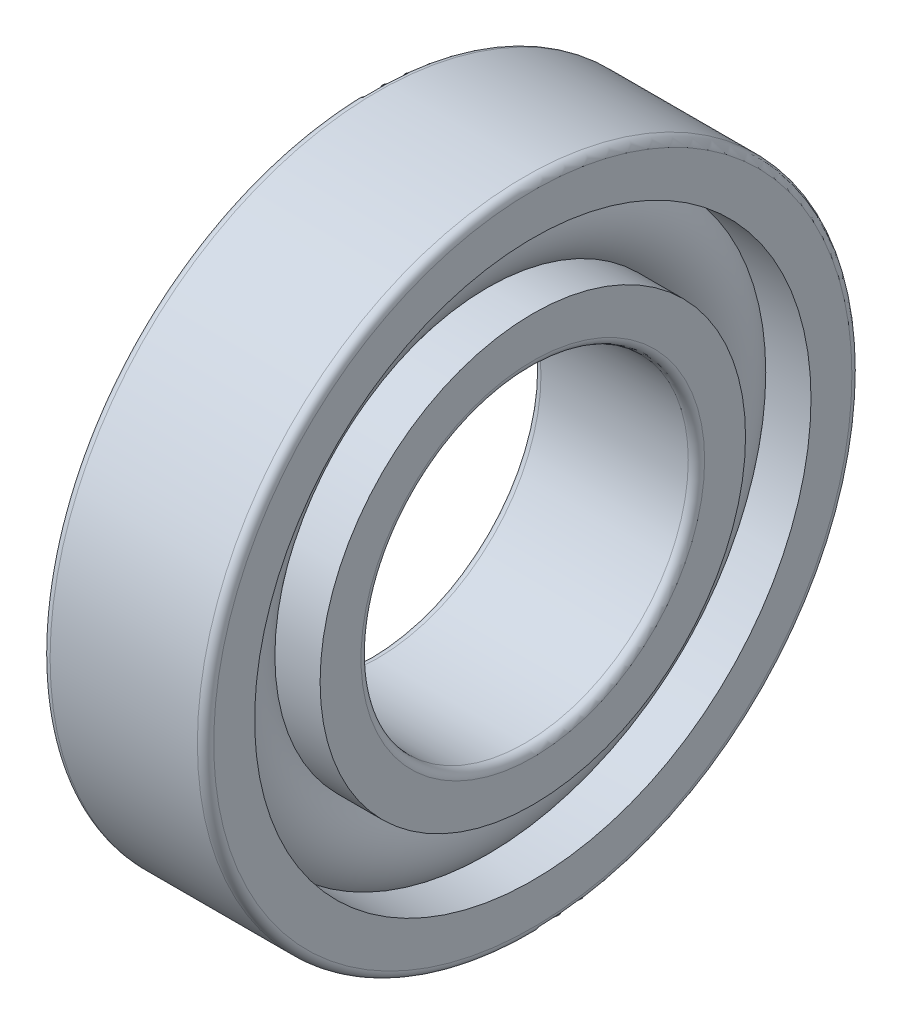
ISO-10303-21;
HEADER;
FILE_DESCRIPTION(('STEP AP214'),'2;1');
FILE_NAME('part.step','',(''),(''),'','','');
FILE_SCHEMA(('AUTOMOTIVE_DESIGN { 1 0 10303 214 1 1 1 1 }'));
ENDSEC;
DATA;
#1=APPLICATION_CONTEXT('core data for automotive mechanical design processes');
#2=APPLICATION_PROTOCOL_DEFINITION('international standard','automotive_design',2000,#1);
#3=PRODUCT_CONTEXT('',#1,'mechanical');
#4=PRODUCT('Part','Part','',(#3));
#5=PRODUCT_RELATED_PRODUCT_CATEGORY('part','',(#4));
#6=PRODUCT_DEFINITION_FORMATION('','',#4);
#7=PRODUCT_DEFINITION_CONTEXT('part definition',#1,'design');
#8=PRODUCT_DEFINITION('design','',#6,#7);
#9=PRODUCT_DEFINITION_SHAPE('','',#8);
#10=(LENGTH_UNIT() NAMED_UNIT(*) SI_UNIT(.MILLI.,.METRE.));
#11=(NAMED_UNIT(*) PLANE_ANGLE_UNIT() SI_UNIT($,.RADIAN.));
#12=(NAMED_UNIT(*) SI_UNIT($,.STERADIAN.) SOLID_ANGLE_UNIT());
#13=UNCERTAINTY_MEASURE_WITH_UNIT(LENGTH_MEASURE(1.E-05),#10,'distance_accuracy_value','');
#14=(GEOMETRIC_REPRESENTATION_CONTEXT(3) GLOBAL_UNCERTAINTY_ASSIGNED_CONTEXT((#13)) GLOBAL_UNIT_ASSIGNED_CONTEXT((#10,
#11,#12)) REPRESENTATION_CONTEXT('',''));
#15=CARTESIAN_POINT('',(0.,0.,0.));
#16=DIRECTION('',(0.,0.,1.));
#17=DIRECTION('',(1.,0.,0.));
#18=AXIS2_PLACEMENT_3D('',#15,#16,#17);
#19=CARTESIAN_POINT('',(0.,0.,0.));
#20=DIRECTION('',(-1.,0.,0.));
#21=DIRECTION('',(0.,0.,1.));
#22=AXIS2_PLACEMENT_3D('',#19,#20,#21);
#23=TOROIDAL_SURFACE('',#22,6.,1.2);
#24=CARTESIAN_POINT('',(0.894427190999912,0.,0.));
#25=DIRECTION('',(-1.,0.,0.));
#26=DIRECTION('',(0.,0.,1.));
#27=AXIS2_PLACEMENT_3D('',#24,#25,#26);
#28=CIRCLE('',#27,6.8);
#29=CARTESIAN_POINT('',(0.894427190999912,0.,6.8));
#30=VERTEX_POINT('',#29);
#31=EDGE_CURVE('E35',#30,#30,#28,.F.);
#32=ORIENTED_EDGE('',*,*,#31,.T.);
#33=EDGE_LOOP('',(#32));
#34=FACE_BOUND('',#33,.T.);
#35=CARTESIAN_POINT('',(0.894427190999914,0.,0.));
#36=DIRECTION('',(-1.,0.,0.));
#37=DIRECTION('',(0.,0.,1.));
#38=AXIS2_PLACEMENT_3D('',#35,#36,#37);
#39=CIRCLE('',#38,5.2);
#40=CARTESIAN_POINT('',(0.894427190999914,0.,5.2));
#41=VERTEX_POINT('',#40);
#42=EDGE_CURVE('E10',#41,#41,#39,.T.);
#43=ORIENTED_EDGE('',*,*,#42,.T.);
#44=EDGE_LOOP('',(#43));
#45=FACE_BOUND('',#44,.T.);
#46=ADVANCED_FACE('F31',(#34,#45),#23,.T.);
#47=CARTESIAN_POINT('',(-20.6375,0.,0.));
#48=DIRECTION('',(1.,0.,0.));
#49=DIRECTION('',(0.,0.,-1.));
#50=AXIS2_PLACEMENT_3D('',#47,#48,#49);
#51=CYLINDRICAL_SURFACE('',#50,5.2);
#52=CARTESIAN_POINT('',(2.,0.,0.));
#53=DIRECTION('',(1.,0.,0.));
#54=DIRECTION('',(0.,0.,-1.));
#55=AXIS2_PLACEMENT_3D('',#52,#53,#54);
#56=CIRCLE('',#55,5.2);
#57=CARTESIAN_POINT('',(2.,0.,-5.2));
#58=VERTEX_POINT('',#57);
#59=EDGE_CURVE('E44',#58,#58,#56,.T.);
#60=ORIENTED_EDGE('',*,*,#59,.F.);
#61=EDGE_LOOP('',(#60));
#62=FACE_BOUND('',#61,.T.);
#63=ORIENTED_EDGE('',*,*,#42,.F.);
#64=EDGE_LOOP('',(#63));
#65=FACE_BOUND('',#64,.T.);
#66=ADVANCED_FACE('F83',(#62,#65),#51,.T.);
#67=CARTESIAN_POINT('',(-20.6375,0.,0.));
#68=DIRECTION('',(1.,0.,0.));
#69=DIRECTION('',(0.,0.,-1.));
#70=AXIS2_PLACEMENT_3D('',#67,#68,#69);
#71=CYLINDRICAL_SURFACE('',#70,5.2);
#72=CARTESIAN_POINT('',(-2.,0.,0.));
#73=DIRECTION('',(1.,0.,0.));
#74=DIRECTION('',(0.,0.,-1.));
#75=AXIS2_PLACEMENT_3D('',#72,#73,#74);
#76=CIRCLE('',#75,5.2);
#77=CARTESIAN_POINT('',(-2.,0.,-5.2));
#78=VERTEX_POINT('',#77);
#79=EDGE_CURVE('E53',#78,#78,#76,.T.);
#80=ORIENTED_EDGE('',*,*,#79,.T.);
#81=EDGE_LOOP('',(#80));
#82=FACE_BOUND('',#81,.T.);
#83=CARTESIAN_POINT('',(-0.894427190999914,0.,0.));
#84=DIRECTION('',(1.,0.,0.));
#85=DIRECTION('',(0.,0.,-1.));
#86=AXIS2_PLACEMENT_3D('',#83,#84,#85);
#87=CIRCLE('',#86,5.2);
#88=CARTESIAN_POINT('',(-0.894427190999914,0.,-5.2));
#89=VERTEX_POINT('',#88);
#90=EDGE_CURVE('E39',#89,#89,#87,.T.);
#91=ORIENTED_EDGE('',*,*,#90,.F.);
#92=EDGE_LOOP('',(#91));
#93=FACE_BOUND('',#92,.T.);
#94=ADVANCED_FACE('F86',(#82,#93),#71,.T.);
#95=CARTESIAN_POINT('',(2.,4.2,0.));
#96=DIRECTION('',(1.,0.,0.));
#97=DIRECTION('',(0.,0.,-1.));
#98=AXIS2_PLACEMENT_3D('',#95,#96,#97);
#99=PLANE('',#98);
#100=ORIENTED_EDGE('',*,*,#59,.T.);
#101=EDGE_LOOP('',(#100));
#102=FACE_BOUND('',#101,.T.);
#103=CARTESIAN_POINT('',(2.,0.,0.));
#104=DIRECTION('',(1.,0.,0.));
#105=DIRECTION('',(0.,0.,-1.));
#106=AXIS2_PLACEMENT_3D('',#103,#104,#105);
#107=CIRCLE('',#106,4.2);
#108=CARTESIAN_POINT('',(2.,0.,-4.2));
#109=VERTEX_POINT('',#108);
#110=EDGE_CURVE('E75',#109,#109,#107,.T.);
#111=ORIENTED_EDGE('',*,*,#110,.F.);
#112=EDGE_LOOP('',(#111));
#113=FACE_BOUND('',#112,.T.);
#114=ADVANCED_FACE('F80',(#102,#113),#99,.T.);
#115=CARTESIAN_POINT('',(1.8,0.,0.));
#116=DIRECTION('',(1.,0.,0.));
#117=DIRECTION('',(0.,0.,-1.));
#118=AXIS2_PLACEMENT_3D('',#115,#116,#117);
#119=TOROIDAL_SURFACE('',#118,4.2,0.2);
#120=ORIENTED_EDGE('',*,*,#110,.T.);
#121=EDGE_LOOP('',(#120));
#122=FACE_BOUND('',#121,.T.);
#123=CARTESIAN_POINT('',(1.8,0.,0.));
#124=DIRECTION('',(1.,0.,0.));
#125=DIRECTION('',(0.,0.,-1.));
#126=AXIS2_PLACEMENT_3D('',#123,#124,#125);
#127=CIRCLE('',#126,4.);
#128=CARTESIAN_POINT('',(1.8,0.,-4.));
#129=VERTEX_POINT('',#128);
#130=EDGE_CURVE('E72',#129,#129,#127,.T.);
#131=ORIENTED_EDGE('',*,*,#130,.F.);
#132=EDGE_LOOP('',(#131));
#133=FACE_BOUND('',#132,.T.);
#134=ADVANCED_FACE('F97',(#122,#133),#119,.T.);
#135=CARTESIAN_POINT('',(-20.6375,0.,0.));
#136=DIRECTION('',(1.,0.,0.));
#137=DIRECTION('',(0.,0.,-1.));
#138=AXIS2_PLACEMENT_3D('',#135,#136,#137);
#139=CYLINDRICAL_SURFACE('',#138,4.);
#140=ORIENTED_EDGE('',*,*,#130,.T.);
#141=EDGE_LOOP('',(#140));
#142=FACE_BOUND('',#141,.T.);
#143=CARTESIAN_POINT('',(-1.8,0.,0.));
#144=DIRECTION('',(1.,0.,0.));
#145=DIRECTION('',(0.,0.,-1.));
#146=AXIS2_PLACEMENT_3D('',#143,#144,#145);
#147=CIRCLE('',#146,4.);
#148=CARTESIAN_POINT('',(-1.8,0.,-4.));
#149=VERTEX_POINT('',#148);
#150=EDGE_CURVE('E69',#149,#149,#147,.T.);
#151=ORIENTED_EDGE('',*,*,#150,.F.);
#152=EDGE_LOOP('',(#151));
#153=FACE_BOUND('',#152,.T.);
#154=ADVANCED_FACE('F100',(#142,#153),#139,.F.);
#155=CARTESIAN_POINT('',(-1.8,0.,0.));
#156=DIRECTION('',(1.,0.,0.));
#157=DIRECTION('',(0.,0.,-1.));
#158=AXIS2_PLACEMENT_3D('',#155,#156,#157);
#159=TOROIDAL_SURFACE('',#158,4.2,0.2);
#160=ORIENTED_EDGE('',*,*,#150,.T.);
#161=EDGE_LOOP('',(#160));
#162=FACE_BOUND('',#161,.T.);
#163=CARTESIAN_POINT('',(-2.,0.,0.));
#164=DIRECTION('',(1.,0.,0.));
#165=DIRECTION('',(0.,0.,-1.));
#166=AXIS2_PLACEMENT_3D('',#163,#164,#165);
#167=CIRCLE('',#166,4.2);
#168=CARTESIAN_POINT('',(-2.,0.,-4.2));
#169=VERTEX_POINT('',#168);
#170=EDGE_CURVE('E66',#169,#169,#167,.T.);
#171=ORIENTED_EDGE('',*,*,#170,.F.);
#172=EDGE_LOOP('',(#171));
#173=FACE_BOUND('',#172,.T.);
#174=ADVANCED_FACE('F104',(#162,#173),#159,.T.);
#175=CARTESIAN_POINT('',(-2.,5.2,0.));
#176=DIRECTION('',(-1.,0.,0.));
#177=DIRECTION('',(0.,0.,1.));
#178=AXIS2_PLACEMENT_3D('',#175,#176,#177);
#179=PLANE('',#178);
#180=ORIENTED_EDGE('',*,*,#170,.T.);
#181=EDGE_LOOP('',(#180));
#182=FACE_BOUND('',#181,.T.);
#183=ORIENTED_EDGE('',*,*,#79,.F.);
#184=EDGE_LOOP('',(#183));
#185=FACE_BOUND('',#184,.T.);
#186=ADVANCED_FACE('F108',(#182,#185),#179,.T.);
#187=CARTESIAN_POINT('',(-0.894427190999912,0.,0.));
#188=DIRECTION('',(1.,0.,0.));
#189=DIRECTION('',(0.,0.,-1.));
#190=AXIS2_PLACEMENT_3D('',#187,#188,#189);
#191=CIRCLE('',#190,6.8);
#192=CARTESIAN_POINT('',(-0.894427190999912,0.,-6.8));
#193=VERTEX_POINT('',#192);
#194=EDGE_CURVE('E47',#193,#193,#191,.F.);
#195=ORIENTED_EDGE('',*,*,#194,.T.);
#196=EDGE_LOOP('',(#195));
#197=FACE_BOUND('',#196,.T.);
#198=ORIENTED_EDGE('',*,*,#90,.T.);
#199=EDGE_LOOP('',(#198));
#200=FACE_BOUND('',#199,.T.);
#201=ADVANCED_FACE('F33',(#197,#200),#23,.T.);
#202=CARTESIAN_POINT('',(-20.6375,0.,0.));
#203=DIRECTION('',(1.,0.,0.));
#204=DIRECTION('',(0.,0.,-1.));
#205=AXIS2_PLACEMENT_3D('',#202,#203,#204);
#206=CYLINDRICAL_SURFACE('',#205,6.8);
#207=CARTESIAN_POINT('',(2.,0.,0.));
#208=DIRECTION('',(1.,0.,0.));
#209=DIRECTION('',(0.,0.,-1.));
#210=AXIS2_PLACEMENT_3D('',#207,#208,#209);
#211=CIRCLE('',#210,6.8);
#212=CARTESIAN_POINT('',(2.,0.,-6.8));
#213=VERTEX_POINT('',#212);
#214=EDGE_CURVE('E49',#213,#213,#211,.T.);
#215=ORIENTED_EDGE('',*,*,#214,.T.);
#216=EDGE_LOOP('',(#215));
#217=FACE_BOUND('',#216,.T.);
#218=ORIENTED_EDGE('',*,*,#31,.F.);
#219=EDGE_LOOP('',(#218));
#220=FACE_BOUND('',#219,.T.);
#221=ADVANCED_FACE('F113',(#217,#220),#206,.F.);
#222=CARTESIAN_POINT('',(-20.6375,0.,0.));
#223=DIRECTION('',(1.,0.,0.));
#224=DIRECTION('',(0.,0.,-1.));
#225=AXIS2_PLACEMENT_3D('',#222,#223,#224);
#226=CYLINDRICAL_SURFACE('',#225,6.8);
#227=CARTESIAN_POINT('',(-2.,0.,0.));
#228=DIRECTION('',(1.,0.,0.));
#229=DIRECTION('',(0.,0.,-1.));
#230=AXIS2_PLACEMENT_3D('',#227,#228,#229);
#231=CIRCLE('',#230,6.8);
#232=CARTESIAN_POINT('',(-2.,0.,-6.8));
#233=VERTEX_POINT('',#232);
#234=EDGE_CURVE('E144',#233,#233,#231,.T.);
#235=ORIENTED_EDGE('',*,*,#234,.F.);
#236=EDGE_LOOP('',(#235));
#237=FACE_BOUND('',#236,.T.);
#238=ORIENTED_EDGE('',*,*,#194,.F.);
#239=EDGE_LOOP('',(#238));
#240=FACE_BOUND('',#239,.T.);
#241=ADVANCED_FACE('F116',(#237,#240),#226,.F.);
#242=CARTESIAN_POINT('',(2.,7.80000000000001,0.));
#243=DIRECTION('',(1.,0.,0.));
#244=DIRECTION('',(0.,0.,-1.));
#245=AXIS2_PLACEMENT_3D('',#242,#243,#244);
#246=PLANE('',#245);
#247=CARTESIAN_POINT('',(2.,0.,0.));
#248=DIRECTION('',(1.,0.,0.));
#249=DIRECTION('',(0.,0.,-1.));
#250=AXIS2_PLACEMENT_3D('',#247,#248,#249);
#251=CIRCLE('',#250,7.80000000000001);
#252=CARTESIAN_POINT('',(2.,0.,-7.80000000000001));
#253=VERTEX_POINT('',#252);
#254=EDGE_CURVE('E55',#253,#253,#251,.T.);
#255=ORIENTED_EDGE('',*,*,#254,.T.);
#256=EDGE_LOOP('',(#255));
#257=FACE_BOUND('',#256,.T.);
#258=ORIENTED_EDGE('',*,*,#214,.F.);
#259=EDGE_LOOP('',(#258));
#260=FACE_BOUND('',#259,.T.);
#261=ADVANCED_FACE('F117',(#257,#260),#246,.T.);
#262=CARTESIAN_POINT('',(1.8,0.,0.));
#263=DIRECTION('',(1.,0.,0.));
#264=DIRECTION('',(0.,0.,-1.));
#265=AXIS2_PLACEMENT_3D('',#262,#263,#264);
#266=TOROIDAL_SURFACE('',#265,7.80000000000001,0.200000000000002);
#267=CARTESIAN_POINT('',(1.8,0.,0.));
#268=DIRECTION('',(1.,0.,0.));
#269=DIRECTION('',(0.,0.,-1.));
#270=AXIS2_PLACEMENT_3D('',#267,#268,#269);
#271=CIRCLE('',#270,8.00000000000001);
#272=CARTESIAN_POINT('',(1.8,0.,-8.00000000000001));
#273=VERTEX_POINT('',#272);
#274=EDGE_CURVE('E60',#273,#273,#271,.T.);
#275=ORIENTED_EDGE('',*,*,#274,.T.);
#276=EDGE_LOOP('',(#275));
#277=FACE_BOUND('',#276,.T.);
#278=ORIENTED_EDGE('',*,*,#254,.F.);
#279=EDGE_LOOP('',(#278));
#280=FACE_BOUND('',#279,.T.);
#281=ADVANCED_FACE('F120',(#277,#280),#266,.T.);
#282=CARTESIAN_POINT('',(-20.6375,0.,0.));
#283=DIRECTION('',(1.,0.,0.));
#284=DIRECTION('',(0.,0.,-1.));
#285=AXIS2_PLACEMENT_3D('',#282,#283,#284);
#286=CYLINDRICAL_SURFACE('',#285,8.00000000000001);
#287=CARTESIAN_POINT('',(-1.8,0.,0.));
#288=DIRECTION('',(1.,0.,0.));
#289=DIRECTION('',(0.,0.,-1.));
#290=AXIS2_PLACEMENT_3D('',#287,#288,#289);
#291=CIRCLE('',#290,8.00000000000001);
#292=CARTESIAN_POINT('',(-1.8,0.,-8.00000000000001));
#293=VERTEX_POINT('',#292);
#294=EDGE_CURVE('E148',#293,#293,#291,.T.);
#295=ORIENTED_EDGE('',*,*,#294,.T.);
#296=EDGE_LOOP('',(#295));
#297=FACE_BOUND('',#296,.T.);
#298=ORIENTED_EDGE('',*,*,#274,.F.);
#299=EDGE_LOOP('',(#298));
#300=FACE_BOUND('',#299,.T.);
#301=ADVANCED_FACE('F124',(#297,#300),#286,.T.);
#302=CARTESIAN_POINT('',(-1.8,0.,0.));
#303=DIRECTION('',(1.,0.,0.));
#304=DIRECTION('',(0.,0.,-1.));
#305=AXIS2_PLACEMENT_3D('',#302,#303,#304);
#306=TOROIDAL_SURFACE('',#305,7.80000000000001,0.200000000000002);
#307=CARTESIAN_POINT('',(-2.,0.,0.));
#308=DIRECTION('',(1.,0.,0.));
#309=DIRECTION('',(0.,0.,-1.));
#310=AXIS2_PLACEMENT_3D('',#307,#308,#309);
#311=CIRCLE('',#310,7.80000000000001);
#312=CARTESIAN_POINT('',(-2.,0.,-7.80000000000001));
#313=VERTEX_POINT('',#312);
#314=EDGE_CURVE('E145',#313,#313,#311,.T.);
#315=ORIENTED_EDGE('',*,*,#314,.T.);
#316=EDGE_LOOP('',(#315));
#317=FACE_BOUND('',#316,.T.);
#318=ORIENTED_EDGE('',*,*,#294,.F.);
#319=EDGE_LOOP('',(#318));
#320=FACE_BOUND('',#319,.T.);
#321=ADVANCED_FACE('F128',(#317,#320),#306,.T.);
#322=CARTESIAN_POINT('',(-2.,6.8,0.));
#323=DIRECTION('',(-1.,0.,0.));
#324=DIRECTION('',(0.,0.,1.));
#325=AXIS2_PLACEMENT_3D('',#322,#323,#324);
#326=PLANE('',#325);
#327=ORIENTED_EDGE('',*,*,#234,.T.);
#328=EDGE_LOOP('',(#327));
#329=FACE_BOUND('',#328,.T.);
#330=ORIENTED_EDGE('',*,*,#314,.F.);
#331=EDGE_LOOP('',(#330));
#332=FACE_BOUND('',#331,.T.);
#333=ADVANCED_FACE('F132',(#329,#332),#326,.T.);
#334=CLOSED_SHELL('',(#46,#66,#94,#114,#134,#154,#174,#186,#201,#221,#241,#261,#281,#301,#321,#333));
#335=MANIFOLD_SOLID_BREP('B2',#334);
#336=ADVANCED_BREP_SHAPE_REPRESENTATION('',(#18,#335),#14);
#337=SHAPE_DEFINITION_REPRESENTATION(#9,#336);
ENDSEC;
END-ISO-10303-21;
